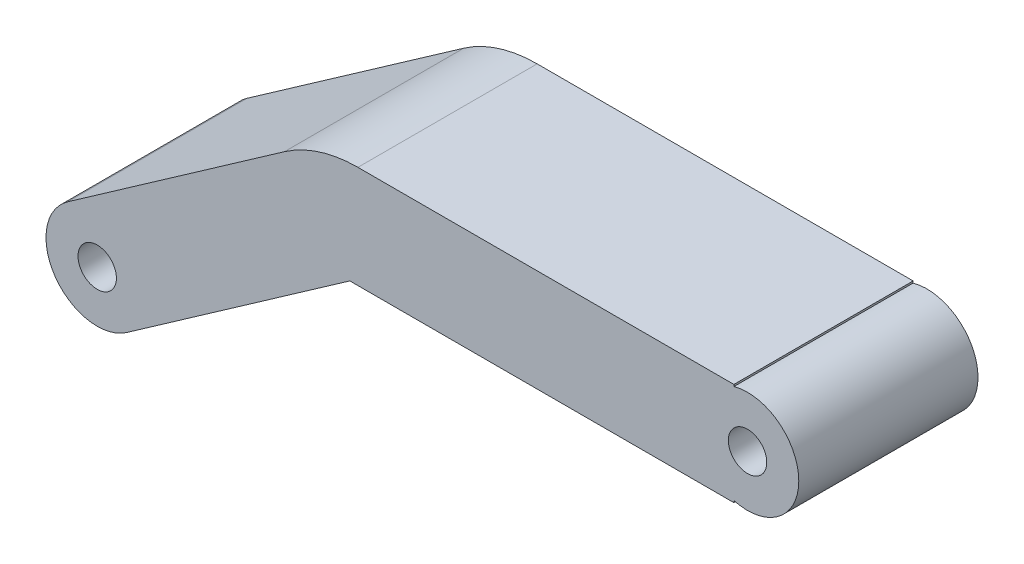
ISO-10303-21;
HEADER;
FILE_DESCRIPTION(('STEP AP214'),'2;1');
FILE_NAME('part.step','',(''),(''),'','','');
FILE_SCHEMA(('AUTOMOTIVE_DESIGN { 1 0 10303 214 1 1 1 1 }'));
ENDSEC;
DATA;
#1=APPLICATION_CONTEXT('core data for automotive mechanical design processes');
#2=APPLICATION_PROTOCOL_DEFINITION('international standard','automotive_design',2000,#1);
#3=PRODUCT_CONTEXT('',#1,'mechanical');
#4=PRODUCT('Part','Part','',(#3));
#5=PRODUCT_RELATED_PRODUCT_CATEGORY('part','',(#4));
#6=PRODUCT_DEFINITION_FORMATION('','',#4);
#7=PRODUCT_DEFINITION_CONTEXT('part definition',#1,'design');
#8=PRODUCT_DEFINITION('design','',#6,#7);
#9=PRODUCT_DEFINITION_SHAPE('','',#8);
#10=(LENGTH_UNIT() NAMED_UNIT(*) SI_UNIT(.MILLI.,.METRE.));
#11=(NAMED_UNIT(*) PLANE_ANGLE_UNIT() SI_UNIT($,.RADIAN.));
#12=(NAMED_UNIT(*) SI_UNIT($,.STERADIAN.) SOLID_ANGLE_UNIT());
#13=UNCERTAINTY_MEASURE_WITH_UNIT(LENGTH_MEASURE(1.E-05),#10,'distance_accuracy_value','');
#14=(GEOMETRIC_REPRESENTATION_CONTEXT(3) GLOBAL_UNCERTAINTY_ASSIGNED_CONTEXT((#13)) GLOBAL_UNIT_ASSIGNED_CONTEXT((#10,
#11,#12)) REPRESENTATION_CONTEXT('',''));
#15=CARTESIAN_POINT('',(0.,0.,0.));
#16=DIRECTION('',(0.,0.,1.));
#17=DIRECTION('',(1.,0.,0.));
#18=AXIS2_PLACEMENT_3D('',#15,#16,#17);
#19=CARTESIAN_POINT('',(16.671823546902,0.161375168062748,14.));
#20=DIRECTION('',(0.,0.,1.));
#21=DIRECTION('',(1.,0.,0.));
#22=AXIS2_PLACEMENT_3D('',#19,#20,#21);
#23=PLANE('',#22);
#24=CARTESIAN_POINT('',(-34.1277151252598,-12.7726322056665,14.));
#25=DIRECTION('',(0.,0.,1.));
#26=DIRECTION('',(1.,0.,0.));
#27=AXIS2_PLACEMENT_3D('',#24,#25,#26);
#28=CIRCLE('',#27,1.5);
#29=CARTESIAN_POINT('',(-32.6277151252598,-12.7726322056665,14.));
#30=VERTEX_POINT('',#29);
#31=EDGE_CURVE('E167',#30,#30,#28,.T.);
#32=ORIENTED_EDGE('',*,*,#31,.F.);
#33=EDGE_LOOP('',(#32));
#34=FACE_BOUND('',#33,.T.);
#35=DIRECTION('',(-1.,0.,0.));
#36=VECTOR('',#35,1.);
#37=CARTESIAN_POINT('',(15.6051568802353,4.16137516806275,14.));
#38=LINE('',#37,#36);
#39=CARTESIAN_POINT('',(15.6051568802353,4.16137516806275,14.));
#40=VERTEX_POINT('',#39);
#41=CARTESIAN_POINT('',(-13.7642455420067,4.16137516806275,14.));
#42=VERTEX_POINT('',#41);
#43=EDGE_CURVE('E152',#40,#42,#38,.T.);
#44=ORIENTED_EDGE('',*,*,#43,.T.);
#45=CARTESIAN_POINT('',(-13.7642455420067,-5.83862483193725,14.));
#46=DIRECTION('',(0.,0.,1.));
#47=DIRECTION('',(1.,0.,0.));
#48=AXIS2_PLACEMENT_3D('',#45,#46,#47);
#49=CIRCLE('',#48,10.);
#50=CARTESIAN_POINT('',(-19.5000099055172,2.35289561095266,14.));
#51=VERTEX_POINT('',#50);
#52=EDGE_CURVE('E11',#42,#51,#49,.T.);
#53=ORIENTED_EDGE('',*,*,#52,.T.);
#54=DIRECTION('',(-0.819152044288991,-0.573576436351048,0.));
#55=VECTOR('',#54,1.);
#56=CARTESIAN_POINT('',(-36.422020870664,-9.49602402851054,14.));
#57=LINE('',#56,#55);
#58=CARTESIAN_POINT('',(-36.422020870664,-9.49602402851054,14.));
#59=VERTEX_POINT('',#58);
#60=EDGE_CURVE('E107',#51,#59,#57,.T.);
#61=ORIENTED_EDGE('',*,*,#60,.T.);
#62=CARTESIAN_POINT('',(-34.1277151252598,-12.7726322056665,14.));
#63=DIRECTION('',(0.,0.,1.));
#64=DIRECTION('',(1.,0.,0.));
#65=AXIS2_PLACEMENT_3D('',#62,#63,#64);
#66=CIRCLE('',#65,4.);
#67=CARTESIAN_POINT('',(-31.8334093798556,-16.0492403828225,14.));
#68=VERTEX_POINT('',#67);
#69=EDGE_CURVE('E110',#59,#68,#66,.T.);
#70=ORIENTED_EDGE('',*,*,#69,.T.);
#71=DIRECTION('',(0.819152044288991,0.573576436351047,0.));
#72=VECTOR('',#71,1.);
#73=CARTESIAN_POINT('',(-14.3948431197647,-3.83862483193725,14.));
#74=LINE('',#73,#72);
#75=CARTESIAN_POINT('',(-14.3948431197647,-3.83862483193725,14.));
#76=VERTEX_POINT('',#75);
#77=EDGE_CURVE('E126',#68,#76,#74,.T.);
#78=ORIENTED_EDGE('',*,*,#77,.T.);
#79=DIRECTION('',(1.,0.,0.));
#80=VECTOR('',#79,1.);
#81=CARTESIAN_POINT('',(15.6051568802353,-3.83862483193725,14.));
#82=LINE('',#81,#80);
#83=CARTESIAN_POINT('',(15.6051568802353,-3.83862483193725,14.));
#84=VERTEX_POINT('',#83);
#85=EDGE_CURVE('E175',#76,#84,#82,.T.);
#86=ORIENTED_EDGE('',*,*,#85,.T.);
#87=DIRECTION('',(0.,1.,0.));
#88=VECTOR('',#87,1.);
#89=CARTESIAN_POINT('',(15.6051568802353,-3.83862483193725,14.));
#90=LINE('',#89,#88);
#91=CARTESIAN_POINT('',(15.6051568802353,-3.69378011055084,14.));
#92=VERTEX_POINT('',#91);
#93=EDGE_CURVE('E173',#84,#92,#90,.T.);
#94=ORIENTED_EDGE('',*,*,#93,.T.);
#95=CARTESIAN_POINT('',(16.671823546902,0.161375168062748,14.));
#96=DIRECTION('',(0.,0.,1.));
#97=DIRECTION('',(1.,0.,0.));
#98=AXIS2_PLACEMENT_3D('',#95,#96,#97);
#99=CIRCLE('',#98,4.);
#100=CARTESIAN_POINT('',(15.6051568802353,4.01653044667634,14.));
#101=VERTEX_POINT('',#100);
#102=EDGE_CURVE('E171',#92,#101,#99,.T.);
#103=ORIENTED_EDGE('',*,*,#102,.T.);
#104=DIRECTION('',(0.,1.,0.));
#105=VECTOR('',#104,1.);
#106=CARTESIAN_POINT('',(15.6051568802353,4.01653044667634,14.));
#107=LINE('',#106,#105);
#108=EDGE_CURVE('E169',#101,#40,#107,.T.);
#109=ORIENTED_EDGE('',*,*,#108,.T.);
#110=EDGE_LOOP('',(#44,#53,#61,#70,#78,#86,#94,#103,#109));
#111=FACE_BOUND('',#110,.T.);
#112=CARTESIAN_POINT('',(16.671823546902,0.161375168062748,14.));
#113=DIRECTION('',(0.,0.,1.));
#114=DIRECTION('',(1.,0.,0.));
#115=AXIS2_PLACEMENT_3D('',#112,#113,#114);
#116=CIRCLE('',#115,1.5);
#117=CARTESIAN_POINT('',(18.171823546902,0.161375168062748,14.));
#118=VERTEX_POINT('',#117);
#119=EDGE_CURVE('E181',#118,#118,#116,.T.);
#120=ORIENTED_EDGE('',*,*,#119,.F.);
#121=EDGE_LOOP('',(#120));
#122=FACE_BOUND('',#121,.T.);
#123=ADVANCED_FACE('F37',(#34,#111,#122),#23,.T.);
#124=CARTESIAN_POINT('',(16.671823546902,0.161375168062748,0.));
#125=DIRECTION('',(0.,0.,1.));
#126=DIRECTION('',(1.,0.,0.));
#127=AXIS2_PLACEMENT_3D('',#124,#125,#126);
#128=PLANE('',#127);
#129=DIRECTION('',(-0.819152044288991,-0.573576436351048,0.));
#130=VECTOR('',#129,1.);
#131=CARTESIAN_POINT('',(-36.422020870664,-9.49602402851054,0.));
#132=LINE('',#131,#130);
#133=CARTESIAN_POINT('',(-19.5000099055172,2.35289561095266,0.));
#134=VERTEX_POINT('',#133);
#135=CARTESIAN_POINT('',(-36.422020870664,-9.49602402851054,0.));
#136=VERTEX_POINT('',#135);
#137=EDGE_CURVE('E129',#134,#136,#132,.T.);
#138=ORIENTED_EDGE('',*,*,#137,.F.);
#139=CARTESIAN_POINT('',(-13.7642455420067,-5.83862483193725,0.));
#140=DIRECTION('',(0.,0.,1.));
#141=DIRECTION('',(1.,0.,0.));
#142=AXIS2_PLACEMENT_3D('',#139,#140,#141);
#143=CIRCLE('',#142,10.);
#144=CARTESIAN_POINT('',(-13.7642455420067,4.16137516806275,0.));
#145=VERTEX_POINT('',#144);
#146=EDGE_CURVE('E59',#134,#145,#143,.F.);
#147=ORIENTED_EDGE('',*,*,#146,.T.);
#148=DIRECTION('',(-1.,0.,0.));
#149=VECTOR('',#148,1.);
#150=CARTESIAN_POINT('',(15.6051568802353,4.16137516806275,0.));
#151=LINE('',#150,#149);
#152=CARTESIAN_POINT('',(15.6051568802353,4.16137516806275,0.));
#153=VERTEX_POINT('',#152);
#154=EDGE_CURVE('E117',#153,#145,#151,.T.);
#155=ORIENTED_EDGE('',*,*,#154,.F.);
#156=DIRECTION('',(0.,1.,0.));
#157=VECTOR('',#156,1.);
#158=CARTESIAN_POINT('',(15.6051568802353,4.01653044667634,0.));
#159=LINE('',#158,#157);
#160=CARTESIAN_POINT('',(15.6051568802353,4.01653044667634,0.));
#161=VERTEX_POINT('',#160);
#162=EDGE_CURVE('E154',#161,#153,#159,.T.);
#163=ORIENTED_EDGE('',*,*,#162,.F.);
#164=CARTESIAN_POINT('',(16.671823546902,0.161375168062748,0.));
#165=DIRECTION('',(0.,0.,1.));
#166=DIRECTION('',(1.,0.,0.));
#167=AXIS2_PLACEMENT_3D('',#164,#165,#166);
#168=CIRCLE('',#167,4.);
#169=CARTESIAN_POINT('',(15.6051568802353,-3.69378011055084,0.));
#170=VERTEX_POINT('',#169);
#171=EDGE_CURVE('E156',#170,#161,#168,.T.);
#172=ORIENTED_EDGE('',*,*,#171,.F.);
#173=DIRECTION('',(0.,1.,0.));
#174=VECTOR('',#173,1.);
#175=CARTESIAN_POINT('',(15.6051568802353,-3.83862483193725,0.));
#176=LINE('',#175,#174);
#177=CARTESIAN_POINT('',(15.6051568802353,-3.83862483193725,0.));
#178=VERTEX_POINT('',#177);
#179=EDGE_CURVE('E158',#178,#170,#176,.T.);
#180=ORIENTED_EDGE('',*,*,#179,.F.);
#181=DIRECTION('',(1.,0.,0.));
#182=VECTOR('',#181,1.);
#183=CARTESIAN_POINT('',(15.6051568802353,-3.83862483193725,0.));
#184=LINE('',#183,#182);
#185=CARTESIAN_POINT('',(-14.3948431197647,-3.83862483193725,0.));
#186=VERTEX_POINT('',#185);
#187=EDGE_CURVE('E160',#186,#178,#184,.T.);
#188=ORIENTED_EDGE('',*,*,#187,.F.);
#189=DIRECTION('',(0.819152044288991,0.573576436351047,0.));
#190=VECTOR('',#189,1.);
#191=CARTESIAN_POINT('',(-14.3948431197647,-3.83862483193725,0.));
#192=LINE('',#191,#190);
#193=CARTESIAN_POINT('',(-31.8334093798556,-16.0492403828225,0.));
#194=VERTEX_POINT('',#193);
#195=EDGE_CURVE('E162',#194,#186,#192,.T.);
#196=ORIENTED_EDGE('',*,*,#195,.F.);
#197=CARTESIAN_POINT('',(-34.1277151252598,-12.7726322056665,0.));
#198=DIRECTION('',(0.,0.,1.));
#199=DIRECTION('',(1.,0.,0.));
#200=AXIS2_PLACEMENT_3D('',#197,#198,#199);
#201=CIRCLE('',#200,4.);
#202=EDGE_CURVE('E164',#136,#194,#201,.T.);
#203=ORIENTED_EDGE('',*,*,#202,.F.);
#204=EDGE_LOOP('',(#138,#147,#155,#163,#172,#180,#188,#196,#203));
#205=FACE_BOUND('',#204,.T.);
#206=CARTESIAN_POINT('',(-34.1277151252598,-12.7726322056665,0.));
#207=DIRECTION('',(0.,0.,1.));
#208=DIRECTION('',(1.,0.,0.));
#209=AXIS2_PLACEMENT_3D('',#206,#207,#208);
#210=CIRCLE('',#209,1.5);
#211=CARTESIAN_POINT('',(-32.6277151252598,-12.7726322056665,0.));
#212=VERTEX_POINT('',#211);
#213=EDGE_CURVE('E178',#212,#212,#210,.T.);
#214=ORIENTED_EDGE('',*,*,#213,.T.);
#215=EDGE_LOOP('',(#214));
#216=FACE_BOUND('',#215,.T.);
#217=CARTESIAN_POINT('',(16.671823546902,0.161375168062748,0.));
#218=DIRECTION('',(0.,0.,1.));
#219=DIRECTION('',(1.,0.,0.));
#220=AXIS2_PLACEMENT_3D('',#217,#218,#219);
#221=CIRCLE('',#220,1.5);
#222=CARTESIAN_POINT('',(18.171823546902,0.161375168062748,0.));
#223=VERTEX_POINT('',#222);
#224=EDGE_CURVE('E184',#223,#223,#221,.T.);
#225=ORIENTED_EDGE('',*,*,#224,.T.);
#226=EDGE_LOOP('',(#225));
#227=FACE_BOUND('',#226,.T.);
#228=ADVANCED_FACE('F193',(#205,#216,#227),#128,.F.);
#229=CARTESIAN_POINT('',(-36.422020870664,-9.49602402851054,14.));
#230=DIRECTION('',(0.573576436351047,-0.819152044288991,0.));
#231=DIRECTION('',(0.819152044288991,0.573576436351048,0.));
#232=AXIS2_PLACEMENT_3D('',#229,#230,#231);
#233=PLANE('',#232);
#234=ORIENTED_EDGE('',*,*,#60,.F.);
#235=DIRECTION('',(0.,0.,-1.));
#236=VECTOR('',#235,1.);
#237=CARTESIAN_POINT('',(-19.5000099055172,2.35289561095265,14.));
#238=LINE('',#237,#236);
#239=EDGE_CURVE('E131',#51,#134,#238,.T.);
#240=ORIENTED_EDGE('',*,*,#239,.T.);
#241=ORIENTED_EDGE('',*,*,#137,.T.);
#242=DIRECTION('',(0.,0.,-1.));
#243=VECTOR('',#242,1.);
#244=CARTESIAN_POINT('',(-36.422020870664,-9.49602402851054,14.));
#245=LINE('',#244,#243);
#246=EDGE_CURVE('E122',#59,#136,#245,.T.);
#247=ORIENTED_EDGE('',*,*,#246,.F.);
#248=EDGE_LOOP('',(#234,#240,#241,#247));
#249=FACE_BOUND('',#248,.T.);
#250=ADVANCED_FACE('F128',(#249),#233,.F.);
#251=CARTESIAN_POINT('',(-34.1277151252598,-12.7726322056665,14.));
#252=DIRECTION('',(0.,0.,-1.));
#253=DIRECTION('',(-1.,0.,0.));
#254=AXIS2_PLACEMENT_3D('',#251,#252,#253);
#255=CYLINDRICAL_SURFACE('',#254,4.);
#256=ORIENTED_EDGE('',*,*,#202,.T.);
#257=DIRECTION('',(0.,0.,-1.));
#258=VECTOR('',#257,1.);
#259=CARTESIAN_POINT('',(-31.8334093798556,-16.0492403828225,14.));
#260=LINE('',#259,#258);
#261=EDGE_CURVE('E124',#68,#194,#260,.T.);
#262=ORIENTED_EDGE('',*,*,#261,.F.);
#263=ORIENTED_EDGE('',*,*,#69,.F.);
#264=ORIENTED_EDGE('',*,*,#246,.T.);
#265=EDGE_LOOP('',(#256,#262,#263,#264));
#266=FACE_BOUND('',#265,.T.);
#267=ADVANCED_FACE('F121',(#266),#255,.T.);
#268=CARTESIAN_POINT('',(-14.3948431197647,-3.83862483193725,14.));
#269=DIRECTION('',(-0.573576436351047,0.819152044288991,0.));
#270=DIRECTION('',(-0.819152044288991,-0.573576436351047,0.));
#271=AXIS2_PLACEMENT_3D('',#268,#269,#270);
#272=PLANE('',#271);
#273=ORIENTED_EDGE('',*,*,#195,.T.);
#274=DIRECTION('',(0.,0.,-1.));
#275=VECTOR('',#274,1.);
#276=CARTESIAN_POINT('',(-14.3948431197647,-3.83862483193725,14.));
#277=LINE('',#276,#275);
#278=EDGE_CURVE('E134',#76,#186,#277,.T.);
#279=ORIENTED_EDGE('',*,*,#278,.F.);
#280=ORIENTED_EDGE('',*,*,#77,.F.);
#281=ORIENTED_EDGE('',*,*,#261,.T.);
#282=EDGE_LOOP('',(#273,#279,#280,#281));
#283=FACE_BOUND('',#282,.T.);
#284=ADVANCED_FACE('F223',(#283),#272,.F.);
#285=CARTESIAN_POINT('',(15.6051568802353,-3.83862483193725,14.));
#286=DIRECTION('',(0.,1.,0.));
#287=DIRECTION('',(-1.,0.,0.));
#288=AXIS2_PLACEMENT_3D('',#285,#286,#287);
#289=PLANE('',#288);
#290=ORIENTED_EDGE('',*,*,#187,.T.);
#291=DIRECTION('',(0.,0.,-1.));
#292=VECTOR('',#291,1.);
#293=CARTESIAN_POINT('',(15.6051568802353,-3.83862483193725,14.));
#294=LINE('',#293,#292);
#295=EDGE_CURVE('E140',#84,#178,#294,.T.);
#296=ORIENTED_EDGE('',*,*,#295,.F.);
#297=ORIENTED_EDGE('',*,*,#85,.F.);
#298=ORIENTED_EDGE('',*,*,#278,.T.);
#299=EDGE_LOOP('',(#290,#296,#297,#298));
#300=FACE_BOUND('',#299,.T.);
#301=ADVANCED_FACE('F219',(#300),#289,.F.);
#302=CARTESIAN_POINT('',(15.6051568802353,-3.83862483193725,14.));
#303=DIRECTION('',(-1.,0.,0.));
#304=DIRECTION('',(0.,0.,1.));
#305=AXIS2_PLACEMENT_3D('',#302,#303,#304);
#306=PLANE('',#305);
#307=ORIENTED_EDGE('',*,*,#179,.T.);
#308=DIRECTION('',(0.,0.,-1.));
#309=VECTOR('',#308,1.);
#310=CARTESIAN_POINT('',(15.6051568802353,-3.69378011055084,14.));
#311=LINE('',#310,#309);
#312=EDGE_CURVE('E143',#92,#170,#311,.T.);
#313=ORIENTED_EDGE('',*,*,#312,.F.);
#314=ORIENTED_EDGE('',*,*,#93,.F.);
#315=ORIENTED_EDGE('',*,*,#295,.T.);
#316=EDGE_LOOP('',(#307,#313,#314,#315));
#317=FACE_BOUND('',#316,.T.);
#318=ADVANCED_FACE('F215',(#317),#306,.F.);
#319=CARTESIAN_POINT('',(16.671823546902,0.161375168062748,14.));
#320=DIRECTION('',(0.,0.,-1.));
#321=DIRECTION('',(-1.,0.,0.));
#322=AXIS2_PLACEMENT_3D('',#319,#320,#321);
#323=CYLINDRICAL_SURFACE('',#322,4.);
#324=ORIENTED_EDGE('',*,*,#171,.T.);
#325=DIRECTION('',(0.,0.,-1.));
#326=VECTOR('',#325,1.);
#327=CARTESIAN_POINT('',(15.6051568802353,4.01653044667634,14.));
#328=LINE('',#327,#326);
#329=EDGE_CURVE('E146',#101,#161,#328,.T.);
#330=ORIENTED_EDGE('',*,*,#329,.F.);
#331=ORIENTED_EDGE('',*,*,#102,.F.);
#332=ORIENTED_EDGE('',*,*,#312,.T.);
#333=EDGE_LOOP('',(#324,#330,#331,#332));
#334=FACE_BOUND('',#333,.T.);
#335=ADVANCED_FACE('F211',(#334),#323,.T.);
#336=CARTESIAN_POINT('',(15.6051568802353,4.01653044667634,14.));
#337=DIRECTION('',(-1.,0.,0.));
#338=DIRECTION('',(0.,-1.,0.));
#339=AXIS2_PLACEMENT_3D('',#336,#337,#338);
#340=PLANE('',#339);
#341=ORIENTED_EDGE('',*,*,#162,.T.);
#342=DIRECTION('',(0.,0.,-1.));
#343=VECTOR('',#342,1.);
#344=CARTESIAN_POINT('',(15.6051568802353,4.16137516806275,14.));
#345=LINE('',#344,#343);
#346=EDGE_CURVE('E149',#40,#153,#345,.T.);
#347=ORIENTED_EDGE('',*,*,#346,.F.);
#348=ORIENTED_EDGE('',*,*,#108,.F.);
#349=ORIENTED_EDGE('',*,*,#329,.T.);
#350=EDGE_LOOP('',(#341,#347,#348,#349));
#351=FACE_BOUND('',#350,.T.);
#352=ADVANCED_FACE('F208',(#351),#340,.F.);
#353=CARTESIAN_POINT('',(15.6051568802353,4.16137516806275,14.));
#354=DIRECTION('',(0.,-1.,0.));
#355=DIRECTION('',(1.,0.,0.));
#356=AXIS2_PLACEMENT_3D('',#353,#354,#355);
#357=PLANE('',#356);
#358=ORIENTED_EDGE('',*,*,#154,.T.);
#359=DIRECTION('',(0.,0.,-1.));
#360=VECTOR('',#359,1.);
#361=CARTESIAN_POINT('',(-13.7642455420067,4.16137516806275,14.));
#362=LINE('',#361,#360);
#363=EDGE_CURVE('E45',#145,#42,#362,.F.);
#364=ORIENTED_EDGE('',*,*,#363,.T.);
#365=ORIENTED_EDGE('',*,*,#43,.F.);
#366=ORIENTED_EDGE('',*,*,#346,.T.);
#367=EDGE_LOOP('',(#358,#364,#365,#366));
#368=FACE_BOUND('',#367,.T.);
#369=ADVANCED_FACE('F205',(#368),#357,.F.);
#370=CARTESIAN_POINT('',(-34.1277151252598,-12.7726322056665,14.));
#371=DIRECTION('',(0.,0.,-1.));
#372=DIRECTION('',(-1.,0.,0.));
#373=AXIS2_PLACEMENT_3D('',#370,#371,#372);
#374=CYLINDRICAL_SURFACE('',#373,1.5);
#375=ORIENTED_EDGE('',*,*,#31,.T.);
#376=EDGE_LOOP('',(#375));
#377=FACE_BOUND('',#376,.T.);
#378=ORIENTED_EDGE('',*,*,#213,.F.);
#379=EDGE_LOOP('',(#378));
#380=FACE_BOUND('',#379,.T.);
#381=ADVANCED_FACE('F202',(#377,#380),#374,.F.);
#382=CARTESIAN_POINT('',(16.671823546902,0.161375168062748,14.));
#383=DIRECTION('',(0.,0.,-1.));
#384=DIRECTION('',(-1.,0.,0.));
#385=AXIS2_PLACEMENT_3D('',#382,#383,#384);
#386=CYLINDRICAL_SURFACE('',#385,1.5);
#387=ORIENTED_EDGE('',*,*,#119,.T.);
#388=EDGE_LOOP('',(#387));
#389=FACE_BOUND('',#388,.T.);
#390=ORIENTED_EDGE('',*,*,#224,.F.);
#391=EDGE_LOOP('',(#390));
#392=FACE_BOUND('',#391,.T.);
#393=ADVANCED_FACE('F190',(#389,#392),#386,.F.);
#394=CARTESIAN_POINT('',(-13.7642455420067,-5.83862483193725,14.));
#395=DIRECTION('',(0.,0.,-1.));
#396=DIRECTION('',(-1.,0.,0.));
#397=AXIS2_PLACEMENT_3D('',#394,#395,#396);
#398=CYLINDRICAL_SURFACE('',#397,10.);
#399=ORIENTED_EDGE('',*,*,#52,.F.);
#400=ORIENTED_EDGE('',*,*,#363,.F.);
#401=ORIENTED_EDGE('',*,*,#146,.F.);
#402=ORIENTED_EDGE('',*,*,#239,.F.);
#403=EDGE_LOOP('',(#399,#400,#401,#402));
#404=FACE_BOUND('',#403,.T.);
#405=ADVANCED_FACE('F39',(#404),#398,.T.);
#406=CLOSED_SHELL('',(#123,#228,#250,#267,#284,#301,#318,#335,#352,#369,#381,#393,#405));
#407=MANIFOLD_SOLID_BREP('B2',#406);
#408=ADVANCED_BREP_SHAPE_REPRESENTATION('',(#18,#407),#14);
#409=SHAPE_DEFINITION_REPRESENTATION(#9,#408);
ENDSEC;
END-ISO-10303-21;
